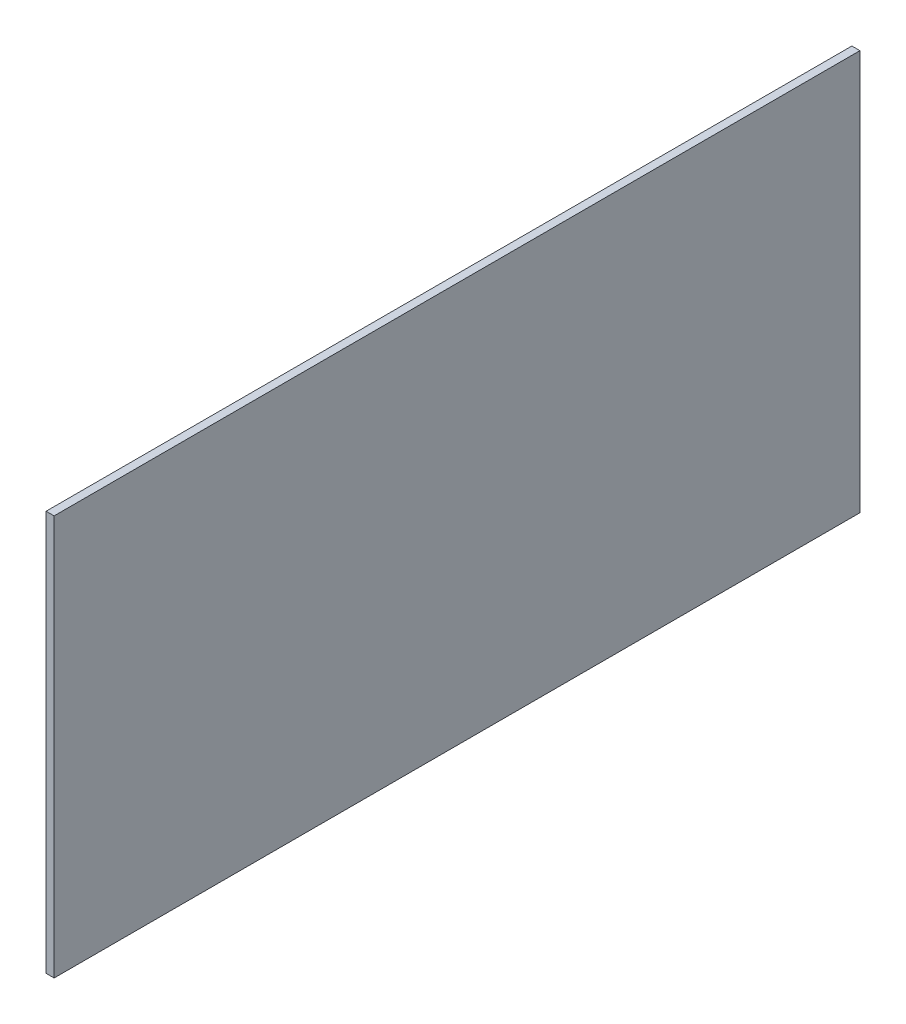
ISO-10303-21;
HEADER;
FILE_DESCRIPTION(('STEP AP214'),'2;1');
FILE_NAME('part.step','',(''),(''),'','','');
FILE_SCHEMA(('AUTOMOTIVE_DESIGN { 1 0 10303 214 1 1 1 1 }'));
ENDSEC;
DATA;
#1=APPLICATION_CONTEXT('core data for automotive mechanical design processes');
#2=APPLICATION_PROTOCOL_DEFINITION('international standard','automotive_design',2000,#1);
#3=PRODUCT_CONTEXT('',#1,'mechanical');
#4=PRODUCT('Part','Part','',(#3));
#5=PRODUCT_RELATED_PRODUCT_CATEGORY('part','',(#4));
#6=PRODUCT_DEFINITION_FORMATION('','',#4);
#7=PRODUCT_DEFINITION_CONTEXT('part definition',#1,'design');
#8=PRODUCT_DEFINITION('design','',#6,#7);
#9=PRODUCT_DEFINITION_SHAPE('','',#8);
#10=(LENGTH_UNIT() NAMED_UNIT(*) SI_UNIT(.MILLI.,.METRE.));
#11=(NAMED_UNIT(*) PLANE_ANGLE_UNIT() SI_UNIT($,.RADIAN.));
#12=(NAMED_UNIT(*) SI_UNIT($,.STERADIAN.) SOLID_ANGLE_UNIT());
#13=UNCERTAINTY_MEASURE_WITH_UNIT(LENGTH_MEASURE(1.E-05),#10,'distance_accuracy_value','');
#14=(GEOMETRIC_REPRESENTATION_CONTEXT(3) GLOBAL_UNCERTAINTY_ASSIGNED_CONTEXT((#13)) GLOBAL_UNIT_ASSIGNED_CONTEXT((#10,
#11,#12)) REPRESENTATION_CONTEXT('',''));
#15=CARTESIAN_POINT('',(0.,0.,0.));
#16=DIRECTION('',(0.,0.,1.));
#17=DIRECTION('',(1.,0.,0.));
#18=AXIS2_PLACEMENT_3D('',#15,#16,#17);
#19=CARTESIAN_POINT('',(-3.,74.5,-150.));
#20=DIRECTION('',(0.,0.,-1.));
#21=DIRECTION('',(-1.,0.,0.));
#22=AXIS2_PLACEMENT_3D('',#19,#20,#21);
#23=PLANE('',#22);
#24=DIRECTION('',(0.,1.,0.));
#25=VECTOR('',#24,1.);
#26=CARTESIAN_POINT('',(0.,74.5,-150.));
#27=LINE('',#26,#25);
#28=CARTESIAN_POINT('',(0.,-74.5,-150.));
#29=VERTEX_POINT('',#28);
#30=CARTESIAN_POINT('',(0.,74.5,-150.));
#31=VERTEX_POINT('',#30);
#32=EDGE_CURVE('E117',#29,#31,#27,.T.);
#33=ORIENTED_EDGE('',*,*,#32,.F.);
#34=DIRECTION('',(1.,0.,0.));
#35=VECTOR('',#34,1.);
#36=CARTESIAN_POINT('',(-3.,-74.5,-150.));
#37=LINE('',#36,#35);
#38=CARTESIAN_POINT('',(-3.,-74.5,-150.));
#39=VERTEX_POINT('',#38);
#40=EDGE_CURVE('E11',#39,#29,#37,.T.);
#41=ORIENTED_EDGE('',*,*,#40,.F.);
#42=DIRECTION('',(0.,1.,0.));
#43=VECTOR('',#42,1.);
#44=CARTESIAN_POINT('',(-3.,74.5,-150.));
#45=LINE('',#44,#43);
#46=CARTESIAN_POINT('',(-3.,74.5,-150.));
#47=VERTEX_POINT('',#46);
#48=EDGE_CURVE('E108',#39,#47,#45,.T.);
#49=ORIENTED_EDGE('',*,*,#48,.T.);
#50=DIRECTION('',(1.,0.,0.));
#51=VECTOR('',#50,1.);
#52=CARTESIAN_POINT('',(-3.,74.5,-150.));
#53=LINE('',#52,#51);
#54=EDGE_CURVE('E49',#47,#31,#53,.T.);
#55=ORIENTED_EDGE('',*,*,#54,.T.);
#56=EDGE_LOOP('',(#33,#41,#49,#55));
#57=FACE_BOUND('',#56,.T.);
#58=ADVANCED_FACE('F46',(#57),#23,.T.);
#59=CARTESIAN_POINT('',(-3.,-74.5,150.));
#60=DIRECTION('',(0.,-1.,0.));
#61=DIRECTION('',(0.,0.,-1.));
#62=AXIS2_PLACEMENT_3D('',#59,#60,#61);
#63=PLANE('',#62);
#64=DIRECTION('',(0.,0.,-1.));
#65=VECTOR('',#64,1.);
#66=CARTESIAN_POINT('',(0.,-74.5,150.));
#67=LINE('',#66,#65);
#68=CARTESIAN_POINT('',(0.,-74.5,150.));
#69=VERTEX_POINT('',#68);
#70=EDGE_CURVE('E112',#69,#29,#67,.T.);
#71=ORIENTED_EDGE('',*,*,#70,.F.);
#72=DIRECTION('',(1.,0.,0.));
#73=VECTOR('',#72,1.);
#74=CARTESIAN_POINT('',(-3.,-74.5,150.));
#75=LINE('',#74,#73);
#76=CARTESIAN_POINT('',(-3.,-74.5,150.));
#77=VERTEX_POINT('',#76);
#78=EDGE_CURVE('E56',#77,#69,#75,.T.);
#79=ORIENTED_EDGE('',*,*,#78,.F.);
#80=DIRECTION('',(0.,0.,-1.));
#81=VECTOR('',#80,1.);
#82=CARTESIAN_POINT('',(-3.,-74.5,150.));
#83=LINE('',#82,#81);
#84=EDGE_CURVE('E103',#77,#39,#83,.T.);
#85=ORIENTED_EDGE('',*,*,#84,.T.);
#86=ORIENTED_EDGE('',*,*,#40,.T.);
#87=EDGE_LOOP('',(#71,#79,#85,#86));
#88=FACE_BOUND('',#87,.T.);
#89=ADVANCED_FACE('F139',(#88),#63,.T.);
#90=CARTESIAN_POINT('',(-3.,74.5,150.));
#91=DIRECTION('',(0.,0.,1.));
#92=DIRECTION('',(1.,0.,0.));
#93=AXIS2_PLACEMENT_3D('',#90,#91,#92);
#94=PLANE('',#93);
#95=DIRECTION('',(0.,-1.,0.));
#96=VECTOR('',#95,1.);
#97=CARTESIAN_POINT('',(0.,74.5,150.));
#98=LINE('',#97,#96);
#99=CARTESIAN_POINT('',(0.,74.5,150.));
#100=VERTEX_POINT('',#99);
#101=EDGE_CURVE('E97',#100,#69,#98,.T.);
#102=ORIENTED_EDGE('',*,*,#101,.F.);
#103=DIRECTION('',(1.,0.,0.));
#104=VECTOR('',#103,1.);
#105=CARTESIAN_POINT('',(-3.,74.5,150.));
#106=LINE('',#105,#104);
#107=CARTESIAN_POINT('',(-3.,74.5,150.));
#108=VERTEX_POINT('',#107);
#109=EDGE_CURVE('E92',#108,#100,#106,.T.);
#110=ORIENTED_EDGE('',*,*,#109,.F.);
#111=DIRECTION('',(0.,-1.,0.));
#112=VECTOR('',#111,1.);
#113=CARTESIAN_POINT('',(-3.,74.5,150.));
#114=LINE('',#113,#112);
#115=EDGE_CURVE('E95',#108,#77,#114,.T.);
#116=ORIENTED_EDGE('',*,*,#115,.T.);
#117=ORIENTED_EDGE('',*,*,#78,.T.);
#118=EDGE_LOOP('',(#102,#110,#116,#117));
#119=FACE_BOUND('',#118,.T.);
#120=ADVANCED_FACE('F94',(#119),#94,.T.);
#121=CARTESIAN_POINT('',(-3.,74.5,150.));
#122=DIRECTION('',(0.,1.,0.));
#123=DIRECTION('',(0.,0.,1.));
#124=AXIS2_PLACEMENT_3D('',#121,#122,#123);
#125=PLANE('',#124);
#126=DIRECTION('',(0.,0.,1.));
#127=VECTOR('',#126,1.);
#128=CARTESIAN_POINT('',(0.,74.5,150.));
#129=LINE('',#128,#127);
#130=EDGE_CURVE('E121',#31,#100,#129,.T.);
#131=ORIENTED_EDGE('',*,*,#130,.F.);
#132=ORIENTED_EDGE('',*,*,#54,.F.);
#133=DIRECTION('',(0.,0.,1.));
#134=VECTOR('',#133,1.);
#135=CARTESIAN_POINT('',(-3.,74.5,150.));
#136=LINE('',#135,#134);
#137=EDGE_CURVE('E102',#47,#108,#136,.T.);
#138=ORIENTED_EDGE('',*,*,#137,.T.);
#139=ORIENTED_EDGE('',*,*,#109,.T.);
#140=EDGE_LOOP('',(#131,#132,#138,#139));
#141=FACE_BOUND('',#140,.T.);
#142=ADVANCED_FACE('F106',(#141),#125,.T.);
#143=CARTESIAN_POINT('',(-3.,0.,0.));
#144=DIRECTION('',(1.,0.,0.));
#145=DIRECTION('',(0.,0.,-1.));
#146=AXIS2_PLACEMENT_3D('',#143,#144,#145);
#147=PLANE('',#146);
#148=ORIENTED_EDGE('',*,*,#48,.F.);
#149=ORIENTED_EDGE('',*,*,#84,.F.);
#150=ORIENTED_EDGE('',*,*,#115,.F.);
#151=ORIENTED_EDGE('',*,*,#137,.F.);
#152=EDGE_LOOP('',(#148,#149,#150,#151));
#153=FACE_BOUND('',#152,.T.);
#154=ADVANCED_FACE('F101',(#153),#147,.F.);
#155=CARTESIAN_POINT('',(0.,0.,0.));
#156=DIRECTION('',(1.,0.,0.));
#157=DIRECTION('',(0.,0.,-1.));
#158=AXIS2_PLACEMENT_3D('',#155,#156,#157);
#159=PLANE('',#158);
#160=ORIENTED_EDGE('',*,*,#32,.T.);
#161=ORIENTED_EDGE('',*,*,#130,.T.);
#162=ORIENTED_EDGE('',*,*,#101,.T.);
#163=ORIENTED_EDGE('',*,*,#70,.T.);
#164=EDGE_LOOP('',(#160,#161,#162,#163));
#165=FACE_BOUND('',#164,.T.);
#166=ADVANCED_FACE('F138',(#165),#159,.T.);
#167=CLOSED_SHELL('',(#58,#89,#120,#142,#154,#166));
#168=MANIFOLD_SOLID_BREP('B2',#167);
#169=ADVANCED_BREP_SHAPE_REPRESENTATION('',(#18,#168),#14);
#170=SHAPE_DEFINITION_REPRESENTATION(#9,#169);
ENDSEC;
END-ISO-10303-21;
